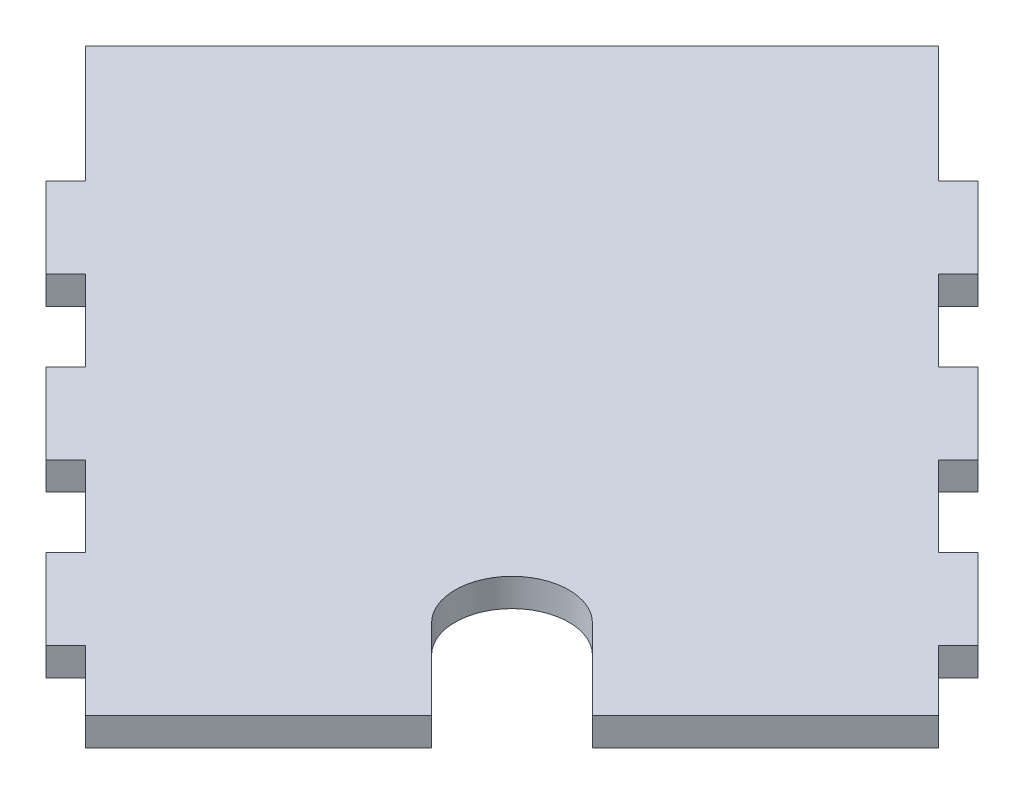
ISO-10303-21;
HEADER;
FILE_DESCRIPTION(('STEP AP214'),'2;1');
FILE_NAME('part.step','',(''),(''),'','','');
FILE_SCHEMA(('AUTOMOTIVE_DESIGN { 1 0 10303 214 1 1 1 1 }'));
ENDSEC;
DATA;
#1=APPLICATION_CONTEXT('core data for automotive mechanical design processes');
#2=APPLICATION_PROTOCOL_DEFINITION('international standard','automotive_design',2000,#1);
#3=PRODUCT_CONTEXT('',#1,'mechanical');
#4=PRODUCT('Part','Part','',(#3));
#5=PRODUCT_RELATED_PRODUCT_CATEGORY('part','',(#4));
#6=PRODUCT_DEFINITION_FORMATION('','',#4);
#7=PRODUCT_DEFINITION_CONTEXT('part definition',#1,'design');
#8=PRODUCT_DEFINITION('design','',#6,#7);
#9=PRODUCT_DEFINITION_SHAPE('','',#8);
#10=(LENGTH_UNIT() NAMED_UNIT(*) SI_UNIT(.MILLI.,.METRE.));
#11=(NAMED_UNIT(*) PLANE_ANGLE_UNIT() SI_UNIT($,.RADIAN.));
#12=(NAMED_UNIT(*) SI_UNIT($,.STERADIAN.) SOLID_ANGLE_UNIT());
#13=UNCERTAINTY_MEASURE_WITH_UNIT(LENGTH_MEASURE(1.E-05),#10,'distance_accuracy_value','');
#14=(GEOMETRIC_REPRESENTATION_CONTEXT(3) GLOBAL_UNCERTAINTY_ASSIGNED_CONTEXT((#13)) GLOBAL_UNIT_ASSIGNED_CONTEXT((#10,
#11,#12)) REPRESENTATION_CONTEXT('',''));
#15=CARTESIAN_POINT('',(0.,0.,0.));
#16=DIRECTION('',(0.,0.,1.));
#17=DIRECTION('',(1.,0.,0.));
#18=AXIS2_PLACEMENT_3D('',#15,#16,#17);
#19=CARTESIAN_POINT('',(123.911019042198,3.1242,-83.2043485428546));
#20=DIRECTION('',(-0.707106781186547,0.,0.707106781186547));
#21=DIRECTION('',(0.707106781186548,0.,0.707106781186548));
#22=AXIS2_PLACEMENT_3D('',#19,#20,#21);
#23=PLANE('',#22);
#24=DIRECTION('',(-0.707106781186548,0.,-0.707106781186548));
#25=VECTOR('',#24,1.);
#26=CARTESIAN_POINT('',(123.911019042198,0.,-83.2043485428546));
#27=LINE('',#26,#25);
#28=CARTESIAN_POINT('',(123.911019042198,0.,-83.2043485428546));
#29=VERTEX_POINT('',#28);
#30=CARTESIAN_POINT('',(114.930762921129,0.,-92.1846046639238));
#31=VERTEX_POINT('',#30);
#32=EDGE_CURVE('E273',#29,#31,#27,.T.);
#33=ORIENTED_EDGE('',*,*,#32,.T.);
#34=DIRECTION('',(0.,-1.,0.));
#35=VECTOR('',#34,1.);
#36=CARTESIAN_POINT('',(114.930762921129,3.1242,-92.1846046639238));
#37=LINE('',#36,#35);
#38=CARTESIAN_POINT('',(114.930762921129,3.1242,-92.1846046639238));
#39=VERTEX_POINT('',#38);
#40=EDGE_CURVE('E11',#39,#31,#37,.T.);
#41=ORIENTED_EDGE('',*,*,#40,.F.);
#42=DIRECTION('',(-0.707106781186548,0.,-0.707106781186548));
#43=VECTOR('',#42,1.);
#44=CARTESIAN_POINT('',(123.911019042198,3.1242,-83.2043485428546));
#45=LINE('',#44,#43);
#46=CARTESIAN_POINT('',(123.911019042198,3.1242,-83.2043485428546));
#47=VERTEX_POINT('',#46);
#48=EDGE_CURVE('E335',#47,#39,#45,.T.);
#49=ORIENTED_EDGE('',*,*,#48,.F.);
#50=DIRECTION('',(0.,-1.,0.));
#51=VECTOR('',#50,1.);
#52=CARTESIAN_POINT('',(123.911019042198,3.1242,-83.2043485428546));
#53=LINE('',#52,#51);
#54=EDGE_CURVE('E269',#47,#29,#53,.T.);
#55=ORIENTED_EDGE('',*,*,#54,.T.);
#56=EDGE_LOOP('',(#33,#41,#49,#55));
#57=FACE_BOUND('',#56,.T.);
#58=ADVANCED_FACE('F33',(#57),#23,.F.);
#59=CARTESIAN_POINT('',(114.930762921129,3.1242,-92.1846046639238));
#60=DIRECTION('',(0.707106781186548,0.,0.707106781186548));
#61=DIRECTION('',(0.707106781186548,0.,-0.707106781186548));
#62=AXIS2_PLACEMENT_3D('',#59,#60,#61);
#63=PLANE('',#62);
#64=DIRECTION('',(-0.707106781186547,0.,0.707106781186547));
#65=VECTOR('',#64,1.);
#66=CARTESIAN_POINT('',(114.930762921129,0.,-92.1846046639238));
#67=LINE('',#66,#65);
#68=CARTESIAN_POINT('',(112.721619915346,0.,-89.9754616581409));
#69=VERTEX_POINT('',#68);
#70=EDGE_CURVE('E276',#31,#69,#67,.T.);
#71=ORIENTED_EDGE('',*,*,#70,.T.);
#72=DIRECTION('',(0.,-1.,0.));
#73=VECTOR('',#72,1.);
#74=CARTESIAN_POINT('',(112.721619915346,3.1242,-89.9754616581409));
#75=LINE('',#74,#73);
#76=CARTESIAN_POINT('',(112.721619915346,3.1242,-89.9754616581409));
#77=VERTEX_POINT('',#76);
#78=EDGE_CURVE('E41',#77,#69,#75,.T.);
#79=ORIENTED_EDGE('',*,*,#78,.F.);
#80=DIRECTION('',(-0.707106781186547,0.,0.707106781186547));
#81=VECTOR('',#80,1.);
#82=CARTESIAN_POINT('',(114.930762921129,3.1242,-92.1846046639238));
#83=LINE('',#82,#81);
#84=EDGE_CURVE('E164',#39,#77,#83,.T.);
#85=ORIENTED_EDGE('',*,*,#84,.F.);
#86=ORIENTED_EDGE('',*,*,#40,.T.);
#87=EDGE_LOOP('',(#71,#79,#85,#86));
#88=FACE_BOUND('',#87,.T.);
#89=ADVANCED_FACE('F513',(#88),#63,.F.);
#90=CARTESIAN_POINT('',(112.721619915346,3.1242,-89.9754616581409));
#91=DIRECTION('',(-0.707106781186548,0.,0.707106781186548));
#92=DIRECTION('',(0.707106781186548,0.,0.707106781186548));
#93=AXIS2_PLACEMENT_3D('',#90,#91,#92);
#94=PLANE('',#93);
#95=DIRECTION('',(-0.707106781186547,0.,-0.707106781186547));
#96=VECTOR('',#95,1.);
#97=CARTESIAN_POINT('',(112.721619915346,0.,-89.9754616581409));
#98=LINE('',#97,#96);
#99=CARTESIAN_POINT('',(103.741363794277,0.,-98.9557177792099));
#100=VERTEX_POINT('',#99);
#101=EDGE_CURVE('E278',#69,#100,#98,.T.);
#102=ORIENTED_EDGE('',*,*,#101,.T.);
#103=DIRECTION('',(0.,-1.,0.));
#104=VECTOR('',#103,1.);
#105=CARTESIAN_POINT('',(103.741363794277,3.1242,-98.9557177792099));
#106=LINE('',#105,#104);
#107=CARTESIAN_POINT('',(103.741363794277,3.1242,-98.9557177792099));
#108=VERTEX_POINT('',#107);
#109=EDGE_CURVE('E414',#108,#100,#106,.T.);
#110=ORIENTED_EDGE('',*,*,#109,.F.);
#111=DIRECTION('',(-0.707106781186547,0.,-0.707106781186547));
#112=VECTOR('',#111,1.);
#113=CARTESIAN_POINT('',(112.721619915346,3.1242,-89.9754616581409));
#114=LINE('',#113,#112);
#115=EDGE_CURVE('E422',#77,#108,#114,.T.);
#116=ORIENTED_EDGE('',*,*,#115,.F.);
#117=ORIENTED_EDGE('',*,*,#78,.T.);
#118=EDGE_LOOP('',(#102,#110,#116,#117));
#119=FACE_BOUND('',#118,.T.);
#120=ADVANCED_FACE('F420',(#119),#94,.F.);
#121=CARTESIAN_POINT('',(103.741363794277,3.1242,-98.9557177792099));
#122=DIRECTION('',(-0.707106781186552,0.,-0.707106781186543));
#123=DIRECTION('',(-0.707106781186543,0.,0.707106781186552));
#124=AXIS2_PLACEMENT_3D('',#121,#122,#123);
#125=PLANE('',#124);
#126=DIRECTION('',(0.707106781186543,0.,-0.707106781186552));
#127=VECTOR('',#126,1.);
#128=CARTESIAN_POINT('',(103.741363794277,0.,-98.9557177792099));
#129=LINE('',#128,#127);
#130=CARTESIAN_POINT('',(105.95050680006,0.,-101.164860784993));
#131=VERTEX_POINT('',#130);
#132=EDGE_CURVE('E280',#100,#131,#129,.T.);
#133=ORIENTED_EDGE('',*,*,#132,.T.);
#134=DIRECTION('',(0.,-1.,0.));
#135=VECTOR('',#134,1.);
#136=CARTESIAN_POINT('',(105.95050680006,3.1242,-101.164860784993));
#137=LINE('',#136,#135);
#138=CARTESIAN_POINT('',(105.95050680006,3.1242,-101.164860784993));
#139=VERTEX_POINT('',#138);
#140=EDGE_CURVE('E411',#139,#131,#137,.T.);
#141=ORIENTED_EDGE('',*,*,#140,.F.);
#142=DIRECTION('',(0.707106781186543,0.,-0.707106781186552));
#143=VECTOR('',#142,1.);
#144=CARTESIAN_POINT('',(103.741363794277,3.1242,-98.9557177792099));
#145=LINE('',#144,#143);
#146=EDGE_CURVE('E440',#108,#139,#145,.T.);
#147=ORIENTED_EDGE('',*,*,#146,.F.);
#148=ORIENTED_EDGE('',*,*,#109,.T.);
#149=EDGE_LOOP('',(#133,#141,#147,#148));
#150=FACE_BOUND('',#149,.T.);
#151=ADVANCED_FACE('F431',(#150),#125,.F.);
#152=CARTESIAN_POINT('',(105.95050680006,3.1242,-101.164860784993));
#153=DIRECTION('',(-0.707106781186565,0.,0.70710678118653));
#154=DIRECTION('',(0.70710678118653,0.,0.707106781186565));
#155=AXIS2_PLACEMENT_3D('',#152,#153,#154);
#156=PLANE('',#155);
#157=DIRECTION('',(-0.70710678118653,0.,-0.707106781186565));
#158=VECTOR('',#157,1.);
#159=CARTESIAN_POINT('',(105.95050680006,0.,-101.164860784993));
#160=LINE('',#159,#158);
#161=CARTESIAN_POINT('',(96.9702506789912,0.,-110.145116906062));
#162=VERTEX_POINT('',#161);
#163=EDGE_CURVE('E282',#131,#162,#160,.T.);
#164=ORIENTED_EDGE('',*,*,#163,.T.);
#165=DIRECTION('',(0.,-1.,0.));
#166=VECTOR('',#165,1.);
#167=CARTESIAN_POINT('',(96.9702506789912,3.1242,-110.145116906062));
#168=LINE('',#167,#166);
#169=CARTESIAN_POINT('',(96.9702506789912,3.1242,-110.145116906062));
#170=VERTEX_POINT('',#169);
#171=EDGE_CURVE('E408',#170,#162,#168,.T.);
#172=ORIENTED_EDGE('',*,*,#171,.F.);
#173=DIRECTION('',(-0.70710678118653,0.,-0.707106781186565));
#174=VECTOR('',#173,1.);
#175=CARTESIAN_POINT('',(105.95050680006,3.1242,-101.164860784993));
#176=LINE('',#175,#174);
#177=EDGE_CURVE('E437',#139,#170,#176,.T.);
#178=ORIENTED_EDGE('',*,*,#177,.F.);
#179=ORIENTED_EDGE('',*,*,#140,.T.);
#180=EDGE_LOOP('',(#164,#172,#178,#179));
#181=FACE_BOUND('',#180,.T.);
#182=ADVANCED_FACE('F435',(#181),#156,.F.);
#183=CARTESIAN_POINT('',(96.9702506789912,3.1242,-110.145116906062));
#184=DIRECTION('',(0.707106781186512,0.,0.707106781186583));
#185=DIRECTION('',(0.707106781186583,0.,-0.707106781186512));
#186=AXIS2_PLACEMENT_3D('',#183,#184,#185);
#187=PLANE('',#186);
#188=DIRECTION('',(-0.707106781186583,0.,0.707106781186512));
#189=VECTOR('',#188,1.);
#190=CARTESIAN_POINT('',(96.9702506789912,0.,-110.145116906062));
#191=LINE('',#190,#189);
#192=CARTESIAN_POINT('',(94.761107673208,0.,-107.935973900279));
#193=VERTEX_POINT('',#192);
#194=EDGE_CURVE('E284',#162,#193,#191,.T.);
#195=ORIENTED_EDGE('',*,*,#194,.T.);
#196=DIRECTION('',(0.,-1.,0.));
#197=VECTOR('',#196,1.);
#198=CARTESIAN_POINT('',(94.761107673208,3.1242,-107.935973900279));
#199=LINE('',#198,#197);
#200=CARTESIAN_POINT('',(94.761107673208,3.1242,-107.935973900279));
#201=VERTEX_POINT('',#200);
#202=EDGE_CURVE('E405',#201,#193,#199,.T.);
#203=ORIENTED_EDGE('',*,*,#202,.F.);
#204=DIRECTION('',(-0.707106781186583,0.,0.707106781186512));
#205=VECTOR('',#204,1.);
#206=CARTESIAN_POINT('',(96.9702506789912,3.1242,-110.145116906062));
#207=LINE('',#206,#205);
#208=EDGE_CURVE('E439',#170,#201,#207,.T.);
#209=ORIENTED_EDGE('',*,*,#208,.F.);
#210=ORIENTED_EDGE('',*,*,#171,.T.);
#211=EDGE_LOOP('',(#195,#203,#209,#210));
#212=FACE_BOUND('',#211,.T.);
#213=ADVANCED_FACE('F526',(#212),#187,.F.);
#214=CARTESIAN_POINT('',(94.761107673208,3.1242,-107.935973900279));
#215=DIRECTION('',(-0.707106781186548,0.,0.707106781186547));
#216=DIRECTION('',(0.707106781186547,0.,0.707106781186548));
#217=AXIS2_PLACEMENT_3D('',#214,#215,#216);
#218=PLANE('',#217);
#219=DIRECTION('',(-0.707106781186547,0.,-0.707106781186548));
#220=VECTOR('',#219,1.);
#221=CARTESIAN_POINT('',(94.761107673208,0.,-107.935973900279));
#222=LINE('',#221,#220);
#223=CARTESIAN_POINT('',(81.7076326651241,0.,-120.989448908363));
#224=VERTEX_POINT('',#223);
#225=EDGE_CURVE('E286',#193,#224,#222,.T.);
#226=ORIENTED_EDGE('',*,*,#225,.T.);
#227=DIRECTION('',(0.,-1.,0.));
#228=VECTOR('',#227,1.);
#229=CARTESIAN_POINT('',(81.7076326651241,3.1242,-120.989448908363));
#230=LINE('',#229,#228);
#231=CARTESIAN_POINT('',(81.7076326651241,3.1242,-120.989448908363));
#232=VERTEX_POINT('',#231);
#233=EDGE_CURVE('E402',#232,#224,#230,.T.);
#234=ORIENTED_EDGE('',*,*,#233,.F.);
#235=DIRECTION('',(-0.707106781186547,0.,-0.707106781186548));
#236=VECTOR('',#235,1.);
#237=CARTESIAN_POINT('',(94.761107673208,3.1242,-107.935973900279));
#238=LINE('',#237,#236);
#239=EDGE_CURVE('E442',#201,#232,#238,.T.);
#240=ORIENTED_EDGE('',*,*,#239,.F.);
#241=ORIENTED_EDGE('',*,*,#202,.T.);
#242=EDGE_LOOP('',(#226,#234,#240,#241));
#243=FACE_BOUND('',#242,.T.);
#244=ADVANCED_FACE('F529',(#243),#218,.F.);
#245=CARTESIAN_POINT('',(81.7076326651241,3.1242,-120.989448908363));
#246=DIRECTION('',(0.707106781186544,0.,0.707106781186551));
#247=DIRECTION('',(0.707106781186551,0.,-0.707106781186544));
#248=AXIS2_PLACEMENT_3D('',#245,#246,#247);
#249=PLANE('',#248);
#250=DIRECTION('',(-0.707106781186551,0.,0.707106781186544));
#251=VECTOR('',#250,1.);
#252=CARTESIAN_POINT('',(81.7076326651241,0.,-120.989448908363));
#253=LINE('',#252,#251);
#254=CARTESIAN_POINT('',(34.1122752234575,0.,-73.394091466697));
#255=VERTEX_POINT('',#254);
#256=EDGE_CURVE('E288',#224,#255,#253,.T.);
#257=ORIENTED_EDGE('',*,*,#256,.T.);
#258=DIRECTION('',(0.,-1.,0.));
#259=VECTOR('',#258,1.);
#260=CARTESIAN_POINT('',(34.1122752234575,3.1242,-73.394091466697));
#261=LINE('',#260,#259);
#262=CARTESIAN_POINT('',(34.1122752234575,3.1242,-73.394091466697));
#263=VERTEX_POINT('',#262);
#264=EDGE_CURVE('E399',#263,#255,#261,.T.);
#265=ORIENTED_EDGE('',*,*,#264,.F.);
#266=DIRECTION('',(-0.707106781186551,0.,0.707106781186544));
#267=VECTOR('',#266,1.);
#268=CARTESIAN_POINT('',(81.7076326651241,3.1242,-120.989448908363));
#269=LINE('',#268,#267);
#270=EDGE_CURVE('E448',#232,#263,#269,.T.);
#271=ORIENTED_EDGE('',*,*,#270,.F.);
#272=ORIENTED_EDGE('',*,*,#233,.T.);
#273=EDGE_LOOP('',(#257,#265,#271,#272));
#274=FACE_BOUND('',#273,.T.);
#275=ADVANCED_FACE('F533',(#274),#249,.F.);
#276=CARTESIAN_POINT('',(34.1122752234575,3.1242,-73.394091466697));
#277=DIRECTION('',(0.707106781186545,0.,-0.70710678118655));
#278=DIRECTION('',(-0.70710678118655,0.,-0.707106781186545));
#279=AXIS2_PLACEMENT_3D('',#276,#277,#278);
#280=PLANE('',#279);
#281=DIRECTION('',(0.70710678118655,0.,0.707106781186545));
#282=VECTOR('',#281,1.);
#283=CARTESIAN_POINT('',(34.1122752234575,0.,-73.394091466697));
#284=LINE('',#283,#282);
#285=CARTESIAN_POINT('',(47.1657502315415,0.,-60.3406164586132));
#286=VERTEX_POINT('',#285);
#287=EDGE_CURVE('E290',#255,#286,#284,.T.);
#288=ORIENTED_EDGE('',*,*,#287,.T.);
#289=DIRECTION('',(0.,-1.,0.));
#290=VECTOR('',#289,1.);
#291=CARTESIAN_POINT('',(47.1657502315415,3.1242,-60.3406164586132));
#292=LINE('',#291,#290);
#293=CARTESIAN_POINT('',(47.1657502315415,3.1242,-60.3406164586132));
#294=VERTEX_POINT('',#293);
#295=EDGE_CURVE('E396',#294,#286,#292,.T.);
#296=ORIENTED_EDGE('',*,*,#295,.F.);
#297=DIRECTION('',(0.70710678118655,0.,0.707106781186545));
#298=VECTOR('',#297,1.);
#299=CARTESIAN_POINT('',(34.1122752234575,3.1242,-73.394091466697));
#300=LINE('',#299,#298);
#301=EDGE_CURVE('E450',#263,#294,#300,.T.);
#302=ORIENTED_EDGE('',*,*,#301,.F.);
#303=ORIENTED_EDGE('',*,*,#264,.T.);
#304=EDGE_LOOP('',(#288,#296,#302,#303));
#305=FACE_BOUND('',#304,.T.);
#306=ADVANCED_FACE('F537',(#305),#280,.F.);
#307=CARTESIAN_POINT('',(47.1657502315415,3.1242,-60.3406164586132));
#308=DIRECTION('',(0.70710678118666,0.,0.707106781186435));
#309=DIRECTION('',(0.707106781186435,0.,-0.70710678118666));
#310=AXIS2_PLACEMENT_3D('',#307,#308,#309);
#311=PLANE('',#310);
#312=DIRECTION('',(-0.707106781186435,0.,0.70710678118666));
#313=VECTOR('',#312,1.);
#314=CARTESIAN_POINT('',(47.1657502315415,0.,-60.3406164586132));
#315=LINE('',#314,#313);
#316=CARTESIAN_POINT('',(44.9566072257586,0.,-58.1314734528295));
#317=VERTEX_POINT('',#316);
#318=EDGE_CURVE('E292',#286,#317,#315,.T.);
#319=ORIENTED_EDGE('',*,*,#318,.T.);
#320=DIRECTION('',(0.,-1.,0.));
#321=VECTOR('',#320,1.);
#322=CARTESIAN_POINT('',(44.9566072257586,3.1242,-58.1314734528295));
#323=LINE('',#322,#321);
#324=CARTESIAN_POINT('',(44.9566072257586,3.1242,-58.1314734528295));
#325=VERTEX_POINT('',#324);
#326=EDGE_CURVE('E393',#325,#317,#323,.T.);
#327=ORIENTED_EDGE('',*,*,#326,.F.);
#328=DIRECTION('',(-0.707106781186435,0.,0.70710678118666));
#329=VECTOR('',#328,1.);
#330=CARTESIAN_POINT('',(47.1657502315415,3.1242,-60.3406164586132));
#331=LINE('',#330,#329);
#332=EDGE_CURVE('E452',#294,#325,#331,.T.);
#333=ORIENTED_EDGE('',*,*,#332,.F.);
#334=ORIENTED_EDGE('',*,*,#295,.T.);
#335=EDGE_LOOP('',(#319,#327,#333,#334));
#336=FACE_BOUND('',#335,.T.);
#337=ADVANCED_FACE('F541',(#336),#311,.F.);
#338=CARTESIAN_POINT('',(44.9566072257586,3.1242,-58.1314734528295));
#339=DIRECTION('',(0.707106781186527,0.,-0.707106781186568));
#340=DIRECTION('',(-0.707106781186568,0.,-0.707106781186527));
#341=AXIS2_PLACEMENT_3D('',#338,#339,#340);
#342=PLANE('',#341);
#343=DIRECTION('',(0.707106781186568,0.,0.707106781186527));
#344=VECTOR('',#343,1.);
#345=CARTESIAN_POINT('',(44.9566072257586,0.,-58.1314734528295));
#346=LINE('',#345,#344);
#347=CARTESIAN_POINT('',(53.936863346828,0.,-49.1512173317606));
#348=VERTEX_POINT('',#347);
#349=EDGE_CURVE('E294',#317,#348,#346,.T.);
#350=ORIENTED_EDGE('',*,*,#349,.T.);
#351=DIRECTION('',(0.,-1.,0.));
#352=VECTOR('',#351,1.);
#353=CARTESIAN_POINT('',(53.936863346828,3.1242,-49.1512173317606));
#354=LINE('',#353,#352);
#355=CARTESIAN_POINT('',(53.936863346828,3.1242,-49.1512173317606));
#356=VERTEX_POINT('',#355);
#357=EDGE_CURVE('E390',#356,#348,#354,.T.);
#358=ORIENTED_EDGE('',*,*,#357,.F.);
#359=DIRECTION('',(0.707106781186568,0.,0.707106781186527));
#360=VECTOR('',#359,1.);
#361=CARTESIAN_POINT('',(44.9566072257586,3.1242,-58.1314734528295));
#362=LINE('',#361,#360);
#363=EDGE_CURVE('E454',#325,#356,#362,.T.);
#364=ORIENTED_EDGE('',*,*,#363,.F.);
#365=ORIENTED_EDGE('',*,*,#326,.T.);
#366=EDGE_LOOP('',(#350,#358,#364,#365));
#367=FACE_BOUND('',#366,.T.);
#368=ADVANCED_FACE('F545',(#367),#342,.F.);
#369=CARTESIAN_POINT('',(53.936863346828,3.1242,-49.1512173317606));
#370=DIRECTION('',(-0.70710678118655,0.,-0.707106781186545));
#371=DIRECTION('',(-0.707106781186545,0.,0.70710678118655));
#372=AXIS2_PLACEMENT_3D('',#369,#370,#371);
#373=PLANE('',#372);
#374=DIRECTION('',(0.707106781186545,0.,-0.70710678118655));
#375=VECTOR('',#374,1.);
#376=CARTESIAN_POINT('',(53.936863346828,0.,-49.1512173317606));
#377=LINE('',#376,#375);
#378=CARTESIAN_POINT('',(56.146006352611,0.,-51.3603603375437));
#379=VERTEX_POINT('',#378);
#380=EDGE_CURVE('E296',#348,#379,#377,.T.);
#381=ORIENTED_EDGE('',*,*,#380,.T.);
#382=DIRECTION('',(0.,-1.,0.));
#383=VECTOR('',#382,1.);
#384=CARTESIAN_POINT('',(56.146006352611,3.1242,-51.3603603375437));
#385=LINE('',#384,#383);
#386=CARTESIAN_POINT('',(56.146006352611,3.1242,-51.3603603375437));
#387=VERTEX_POINT('',#386);
#388=EDGE_CURVE('E387',#387,#379,#385,.T.);
#389=ORIENTED_EDGE('',*,*,#388,.F.);
#390=DIRECTION('',(0.707106781186545,0.,-0.70710678118655));
#391=VECTOR('',#390,1.);
#392=CARTESIAN_POINT('',(53.936863346828,3.1242,-49.1512173317606));
#393=LINE('',#392,#391);
#394=EDGE_CURVE('E456',#356,#387,#393,.T.);
#395=ORIENTED_EDGE('',*,*,#394,.F.);
#396=ORIENTED_EDGE('',*,*,#357,.T.);
#397=EDGE_LOOP('',(#381,#389,#395,#396));
#398=FACE_BOUND('',#397,.T.);
#399=ADVANCED_FACE('F549',(#398),#373,.F.);
#400=CARTESIAN_POINT('',(56.146006352611,3.1242,-51.3603603375437));
#401=DIRECTION('',(0.707106781186544,0.,-0.70710678118655));
#402=DIRECTION('',(-0.707106781186551,0.,-0.707106781186545));
#403=AXIS2_PLACEMENT_3D('',#400,#401,#402);
#404=PLANE('',#403);
#405=DIRECTION('',(0.707106781186551,0.,0.707106781186545));
#406=VECTOR('',#405,1.);
#407=CARTESIAN_POINT('',(56.146006352611,0.,-51.3603603375437));
#408=LINE('',#407,#406);
#409=CARTESIAN_POINT('',(65.1262624736799,0.,-42.3801042164749));
#410=VERTEX_POINT('',#409);
#411=EDGE_CURVE('E298',#379,#410,#408,.T.);
#412=ORIENTED_EDGE('',*,*,#411,.T.);
#413=DIRECTION('',(0.,-1.,0.));
#414=VECTOR('',#413,1.);
#415=CARTESIAN_POINT('',(65.1262624736799,3.1242,-42.3801042164749));
#416=LINE('',#415,#414);
#417=CARTESIAN_POINT('',(65.1262624736799,3.1242,-42.3801042164749));
#418=VERTEX_POINT('',#417);
#419=EDGE_CURVE('E384',#418,#410,#416,.T.);
#420=ORIENTED_EDGE('',*,*,#419,.F.);
#421=DIRECTION('',(0.707106781186551,0.,0.707106781186545));
#422=VECTOR('',#421,1.);
#423=CARTESIAN_POINT('',(56.146006352611,3.1242,-51.3603603375437));
#424=LINE('',#423,#422);
#425=EDGE_CURVE('E458',#387,#418,#424,.T.);
#426=ORIENTED_EDGE('',*,*,#425,.F.);
#427=ORIENTED_EDGE('',*,*,#388,.T.);
#428=EDGE_LOOP('',(#412,#420,#426,#427));
#429=FACE_BOUND('',#428,.T.);
#430=ADVANCED_FACE('F553',(#429),#404,.F.);
#431=CARTESIAN_POINT('',(65.1262624736799,3.1242,-42.3801042164749));
#432=DIRECTION('',(0.707106781186549,0.,0.707106781186546));
#433=DIRECTION('',(0.707106781186546,0.,-0.707106781186549));
#434=AXIS2_PLACEMENT_3D('',#431,#432,#433);
#435=PLANE('',#434);
#436=DIRECTION('',(-0.707106781186546,0.,0.707106781186549));
#437=VECTOR('',#436,1.);
#438=CARTESIAN_POINT('',(65.1262624736799,0.,-42.3801042164749));
#439=LINE('',#438,#437);
#440=CARTESIAN_POINT('',(62.9171194678968,0.,-40.1709612106919));
#441=VERTEX_POINT('',#440);
#442=EDGE_CURVE('E300',#410,#441,#439,.T.);
#443=ORIENTED_EDGE('',*,*,#442,.T.);
#444=DIRECTION('',(0.,-1.,0.));
#445=VECTOR('',#444,1.);
#446=CARTESIAN_POINT('',(62.9171194678968,3.1242,-40.1709612106919));
#447=LINE('',#446,#445);
#448=CARTESIAN_POINT('',(62.9171194678968,3.1242,-40.1709612106919));
#449=VERTEX_POINT('',#448);
#450=EDGE_CURVE('E381',#449,#441,#447,.T.);
#451=ORIENTED_EDGE('',*,*,#450,.F.);
#452=DIRECTION('',(-0.707106781186546,0.,0.707106781186549));
#453=VECTOR('',#452,1.);
#454=CARTESIAN_POINT('',(65.1262624736799,3.1242,-42.3801042164749));
#455=LINE('',#454,#453);
#456=EDGE_CURVE('E460',#418,#449,#455,.T.);
#457=ORIENTED_EDGE('',*,*,#456,.F.);
#458=ORIENTED_EDGE('',*,*,#419,.T.);
#459=EDGE_LOOP('',(#443,#451,#457,#458));
#460=FACE_BOUND('',#459,.T.);
#461=ADVANCED_FACE('F557',(#460),#435,.F.);
#462=CARTESIAN_POINT('',(62.9171194678968,3.1242,-40.1709612106919));
#463=DIRECTION('',(0.707106781186544,0.,-0.707106781186551));
#464=DIRECTION('',(-0.707106781186551,0.,-0.707106781186544));
#465=AXIS2_PLACEMENT_3D('',#462,#463,#464);
#466=PLANE('',#465);
#467=DIRECTION('',(0.707106781186551,0.,0.707106781186544));
#468=VECTOR('',#467,1.);
#469=CARTESIAN_POINT('',(62.9171194678968,0.,-40.1709612106919));
#470=LINE('',#469,#468);
#471=CARTESIAN_POINT('',(71.897375588966,0.,-31.1907050896228));
#472=VERTEX_POINT('',#471);
#473=EDGE_CURVE('E302',#441,#472,#470,.T.);
#474=ORIENTED_EDGE('',*,*,#473,.T.);
#475=DIRECTION('',(0.,-1.,0.));
#476=VECTOR('',#475,1.);
#477=CARTESIAN_POINT('',(71.897375588966,3.1242,-31.1907050896228));
#478=LINE('',#477,#476);
#479=CARTESIAN_POINT('',(71.897375588966,3.1242,-31.1907050896228));
#480=VERTEX_POINT('',#479);
#481=EDGE_CURVE('E378',#480,#472,#478,.T.);
#482=ORIENTED_EDGE('',*,*,#481,.F.);
#483=DIRECTION('',(0.707106781186551,0.,0.707106781186544));
#484=VECTOR('',#483,1.);
#485=CARTESIAN_POINT('',(62.9171194678968,3.1242,-40.1709612106919));
#486=LINE('',#485,#484);
#487=EDGE_CURVE('E462',#449,#480,#486,.T.);
#488=ORIENTED_EDGE('',*,*,#487,.F.);
#489=ORIENTED_EDGE('',*,*,#450,.T.);
#490=EDGE_LOOP('',(#474,#482,#488,#489));
#491=FACE_BOUND('',#490,.T.);
#492=ADVANCED_FACE('F561',(#491),#466,.F.);
#493=CARTESIAN_POINT('',(71.897375588966,3.1242,-31.1907050896228));
#494=DIRECTION('',(-0.70710678118655,0.,-0.707106781186545));
#495=DIRECTION('',(-0.707106781186545,0.,0.70710678118655));
#496=AXIS2_PLACEMENT_3D('',#493,#494,#495);
#497=PLANE('',#496);
#498=DIRECTION('',(0.707106781186545,0.,-0.70710678118655));
#499=VECTOR('',#498,1.);
#500=CARTESIAN_POINT('',(71.897375588966,0.,-31.1907050896228));
#501=LINE('',#500,#499);
#502=CARTESIAN_POINT('',(74.106518594749,0.,-33.3998480954058));
#503=VERTEX_POINT('',#502);
#504=EDGE_CURVE('E304',#472,#503,#501,.T.);
#505=ORIENTED_EDGE('',*,*,#504,.T.);
#506=DIRECTION('',(0.,-1.,0.));
#507=VECTOR('',#506,1.);
#508=CARTESIAN_POINT('',(74.106518594749,3.1242,-33.3998480954058));
#509=LINE('',#508,#507);
#510=CARTESIAN_POINT('',(74.106518594749,3.1242,-33.3998480954058));
#511=VERTEX_POINT('',#510);
#512=EDGE_CURVE('E375',#511,#503,#509,.T.);
#513=ORIENTED_EDGE('',*,*,#512,.F.);
#514=DIRECTION('',(0.707106781186545,0.,-0.70710678118655));
#515=VECTOR('',#514,1.);
#516=CARTESIAN_POINT('',(71.897375588966,3.1242,-31.1907050896228));
#517=LINE('',#516,#515);
#518=EDGE_CURVE('E464',#480,#511,#517,.T.);
#519=ORIENTED_EDGE('',*,*,#518,.F.);
#520=ORIENTED_EDGE('',*,*,#481,.T.);
#521=EDGE_LOOP('',(#505,#513,#519,#520));
#522=FACE_BOUND('',#521,.T.);
#523=ADVANCED_FACE('F565',(#522),#497,.F.);
#524=CARTESIAN_POINT('',(74.106518594749,3.1242,-33.3998480954058));
#525=DIRECTION('',(0.707106781186544,0.,-0.70710678118655));
#526=DIRECTION('',(-0.70710678118655,0.,-0.707106781186545));
#527=AXIS2_PLACEMENT_3D('',#524,#525,#526);
#528=PLANE('',#527);
#529=DIRECTION('',(0.707106781186551,0.,0.707106781186545));
#530=VECTOR('',#529,1.);
#531=CARTESIAN_POINT('',(74.106518594749,0.,-33.3998480954058));
#532=LINE('',#531,#530);
#533=CARTESIAN_POINT('',(83.0867747158182,0.,-24.4195919743367));
#534=VERTEX_POINT('',#533);
#535=EDGE_CURVE('E306',#503,#534,#532,.T.);
#536=ORIENTED_EDGE('',*,*,#535,.T.);
#537=DIRECTION('',(0.,-1.,0.));
#538=VECTOR('',#537,1.);
#539=CARTESIAN_POINT('',(83.0867747158182,3.1242,-24.4195919743367));
#540=LINE('',#539,#538);
#541=CARTESIAN_POINT('',(83.0867747158182,3.1242,-24.4195919743367));
#542=VERTEX_POINT('',#541);
#543=EDGE_CURVE('E372',#542,#534,#540,.T.);
#544=ORIENTED_EDGE('',*,*,#543,.F.);
#545=DIRECTION('',(0.707106781186551,0.,0.707106781186545));
#546=VECTOR('',#545,1.);
#547=CARTESIAN_POINT('',(74.106518594749,3.1242,-33.3998480954058));
#548=LINE('',#547,#546);
#549=EDGE_CURVE('E466',#511,#542,#548,.T.);
#550=ORIENTED_EDGE('',*,*,#549,.F.);
#551=ORIENTED_EDGE('',*,*,#512,.T.);
#552=EDGE_LOOP('',(#536,#544,#550,#551));
#553=FACE_BOUND('',#552,.T.);
#554=ADVANCED_FACE('F569',(#553),#528,.F.);
#555=CARTESIAN_POINT('',(83.0867747158182,3.1242,-24.4195919743367));
#556=DIRECTION('',(0.707106781186545,0.,0.70710678118655));
#557=DIRECTION('',(0.70710678118655,0.,-0.707106781186545));
#558=AXIS2_PLACEMENT_3D('',#555,#556,#557);
#559=PLANE('',#558);
#560=DIRECTION('',(-0.70710678118655,0.,0.707106781186545));
#561=VECTOR('',#560,1.);
#562=CARTESIAN_POINT('',(83.0867747158182,0.,-24.4195919743367));
#563=LINE('',#562,#561);
#564=CARTESIAN_POINT('',(80.8776317100352,0.,-22.2104489685537));
#565=VERTEX_POINT('',#564);
#566=EDGE_CURVE('E308',#534,#565,#563,.T.);
#567=ORIENTED_EDGE('',*,*,#566,.T.);
#568=DIRECTION('',(0.,-1.,0.));
#569=VECTOR('',#568,1.);
#570=CARTESIAN_POINT('',(80.8776317100352,3.1242,-22.2104489685537));
#571=LINE('',#570,#569);
#572=CARTESIAN_POINT('',(80.8776317100352,3.1242,-22.2104489685537));
#573=VERTEX_POINT('',#572);
#574=EDGE_CURVE('E369',#573,#565,#571,.T.);
#575=ORIENTED_EDGE('',*,*,#574,.F.);
#576=DIRECTION('',(-0.70710678118655,0.,0.707106781186545));
#577=VECTOR('',#576,1.);
#578=CARTESIAN_POINT('',(83.0867747158182,3.1242,-24.4195919743367));
#579=LINE('',#578,#577);
#580=EDGE_CURVE('E468',#542,#573,#579,.T.);
#581=ORIENTED_EDGE('',*,*,#580,.F.);
#582=ORIENTED_EDGE('',*,*,#543,.T.);
#583=EDGE_LOOP('',(#567,#575,#581,#582));
#584=FACE_BOUND('',#583,.T.);
#585=ADVANCED_FACE('F573',(#584),#559,.F.);
#586=CARTESIAN_POINT('',(80.8776317100352,3.1242,-22.2104489685537));
#587=DIRECTION('',(0.707106781186545,0.,-0.70710678118655));
#588=DIRECTION('',(-0.70710678118655,0.,-0.707106781186545));
#589=AXIS2_PLACEMENT_3D('',#586,#587,#588);
#590=PLANE('',#589);
#591=DIRECTION('',(0.70710678118655,0.,0.707106781186545));
#592=VECTOR('',#591,1.);
#593=CARTESIAN_POINT('',(80.8776317100352,0.,-22.2104489685537));
#594=LINE('',#593,#592);
#595=CARTESIAN_POINT('',(89.8578878311044,0.,-13.2301928474846));
#596=VERTEX_POINT('',#595);
#597=EDGE_CURVE('E310',#565,#596,#594,.T.);
#598=ORIENTED_EDGE('',*,*,#597,.T.);
#599=DIRECTION('',(0.,-1.,0.));
#600=VECTOR('',#599,1.);
#601=CARTESIAN_POINT('',(89.8578878311044,3.1242,-13.2301928474846));
#602=LINE('',#601,#600);
#603=CARTESIAN_POINT('',(89.8578878311044,3.1242,-13.2301928474846));
#604=VERTEX_POINT('',#603);
#605=EDGE_CURVE('E366',#604,#596,#602,.T.);
#606=ORIENTED_EDGE('',*,*,#605,.F.);
#607=DIRECTION('',(0.70710678118655,0.,0.707106781186545));
#608=VECTOR('',#607,1.);
#609=CARTESIAN_POINT('',(80.8776317100352,3.1242,-22.2104489685537));
#610=LINE('',#609,#608);
#611=EDGE_CURVE('E470',#573,#604,#610,.T.);
#612=ORIENTED_EDGE('',*,*,#611,.F.);
#613=ORIENTED_EDGE('',*,*,#574,.T.);
#614=EDGE_LOOP('',(#598,#606,#612,#613));
#615=FACE_BOUND('',#614,.T.);
#616=ADVANCED_FACE('F577',(#615),#590,.F.);
#617=CARTESIAN_POINT('',(89.8578878311044,3.1242,-13.2301928474846));
#618=DIRECTION('',(-0.70710678118655,0.,-0.707106781186545));
#619=DIRECTION('',(-0.707106781186545,0.,0.70710678118655));
#620=AXIS2_PLACEMENT_3D('',#617,#618,#619);
#621=PLANE('',#620);
#622=DIRECTION('',(0.707106781186545,0.,-0.70710678118655));
#623=VECTOR('',#622,1.);
#624=CARTESIAN_POINT('',(89.8578878311044,0.,-13.2301928474846));
#625=LINE('',#624,#623);
#626=CARTESIAN_POINT('',(92.0670308368874,0.,-15.4393358532676));
#627=VERTEX_POINT('',#626);
#628=EDGE_CURVE('E312',#596,#627,#625,.T.);
#629=ORIENTED_EDGE('',*,*,#628,.T.);
#630=DIRECTION('',(0.,-1.,0.));
#631=VECTOR('',#630,1.);
#632=CARTESIAN_POINT('',(92.0670308368874,3.1242,-15.4393358532676));
#633=LINE('',#632,#631);
#634=CARTESIAN_POINT('',(92.0670308368874,3.1242,-15.4393358532676));
#635=VERTEX_POINT('',#634);
#636=EDGE_CURVE('E363',#635,#627,#633,.T.);
#637=ORIENTED_EDGE('',*,*,#636,.F.);
#638=DIRECTION('',(0.707106781186545,0.,-0.70710678118655));
#639=VECTOR('',#638,1.);
#640=CARTESIAN_POINT('',(89.8578878311044,3.1242,-13.2301928474846));
#641=LINE('',#640,#639);
#642=EDGE_CURVE('E472',#604,#635,#641,.T.);
#643=ORIENTED_EDGE('',*,*,#642,.F.);
#644=ORIENTED_EDGE('',*,*,#605,.T.);
#645=EDGE_LOOP('',(#629,#637,#643,#644));
#646=FACE_BOUND('',#645,.T.);
#647=ADVANCED_FACE('F581',(#646),#621,.F.);
#648=CARTESIAN_POINT('',(92.0670308368874,3.1242,-15.4393358532676));
#649=DIRECTION('',(0.707106781186544,0.,-0.707106781186551));
#650=DIRECTION('',(-0.707106781186551,0.,-0.707106781186544));
#651=AXIS2_PLACEMENT_3D('',#648,#649,#650);
#652=PLANE('',#651);
#653=DIRECTION('',(0.707106781186551,0.,0.707106781186544));
#654=VECTOR('',#653,1.);
#655=CARTESIAN_POINT('',(92.0670308368874,0.,-15.4393358532676));
#656=LINE('',#655,#654);
#657=CARTESIAN_POINT('',(98.8381439521737,0.,-8.66822273798138));
#658=VERTEX_POINT('',#657);
#659=EDGE_CURVE('E314',#627,#658,#656,.T.);
#660=ORIENTED_EDGE('',*,*,#659,.T.);
#661=DIRECTION('',(0.,-1.,0.));
#662=VECTOR('',#661,1.);
#663=CARTESIAN_POINT('',(98.8381439521737,3.1242,-8.66822273798138));
#664=LINE('',#663,#662);
#665=CARTESIAN_POINT('',(98.8381439521737,3.1242,-8.66822273798138));
#666=VERTEX_POINT('',#665);
#667=EDGE_CURVE('E360',#666,#658,#664,.T.);
#668=ORIENTED_EDGE('',*,*,#667,.F.);
#669=DIRECTION('',(0.707106781186551,0.,0.707106781186544));
#670=VECTOR('',#669,1.);
#671=CARTESIAN_POINT('',(92.0670308368874,3.1242,-15.4393358532676));
#672=LINE('',#671,#670);
#673=EDGE_CURVE('E474',#635,#666,#672,.T.);
#674=ORIENTED_EDGE('',*,*,#673,.F.);
#675=ORIENTED_EDGE('',*,*,#636,.T.);
#676=EDGE_LOOP('',(#660,#668,#674,#675));
#677=FACE_BOUND('',#676,.T.);
#678=ADVANCED_FACE('F585',(#677),#652,.F.);
#679=CARTESIAN_POINT('',(98.8381439521737,3.1242,-8.66822273798138));
#680=DIRECTION('',(-0.70710678118655,0.,-0.707106781186545));
#681=DIRECTION('',(-0.707106781186545,0.,0.70710678118655));
#682=AXIS2_PLACEMENT_3D('',#679,#680,#681);
#683=PLANE('',#682);
#684=DIRECTION('',(0.707106781186545,0.,-0.70710678118655));
#685=VECTOR('',#684,1.);
#686=CARTESIAN_POINT('',(98.8381439521737,0.,-8.66822273798138));
#687=LINE('',#686,#685);
#688=CARTESIAN_POINT('',(118.145694612472,0.,-27.9757733982801));
#689=VERTEX_POINT('',#688);
#690=EDGE_CURVE('E316',#658,#689,#687,.T.);
#691=ORIENTED_EDGE('',*,*,#690,.T.);
#692=DIRECTION('',(0.,-1.,0.));
#693=VECTOR('',#692,1.);
#694=CARTESIAN_POINT('',(118.145694612472,3.1242,-27.9757733982801));
#695=LINE('',#694,#693);
#696=CARTESIAN_POINT('',(118.145694612472,3.1242,-27.9757733982801));
#697=VERTEX_POINT('',#696);
#698=EDGE_CURVE('E357',#697,#689,#695,.T.);
#699=ORIENTED_EDGE('',*,*,#698,.F.);
#700=DIRECTION('',(0.707106781186545,0.,-0.70710678118655));
#701=VECTOR('',#700,1.);
#702=CARTESIAN_POINT('',(98.8381439521737,3.1242,-8.66822273798138));
#703=LINE('',#702,#701);
#704=EDGE_CURVE('E476',#666,#697,#703,.T.);
#705=ORIENTED_EDGE('',*,*,#704,.F.);
#706=ORIENTED_EDGE('',*,*,#667,.T.);
#707=EDGE_LOOP('',(#691,#699,#705,#706));
#708=FACE_BOUND('',#707,.T.);
#709=ADVANCED_FACE('F589',(#708),#683,.F.);
#710=CARTESIAN_POINT('',(118.145694612472,3.1242,-27.9757733982801));
#711=DIRECTION('',(-0.707106781186531,0.,0.707106781186564));
#712=DIRECTION('',(0.707106781186564,0.,0.707106781186531));
#713=AXIS2_PLACEMENT_3D('',#710,#711,#712);
#714=PLANE('',#713);
#715=DIRECTION('',(-0.707106781186564,0.,-0.707106781186531));
#716=VECTOR('',#715,1.);
#717=CARTESIAN_POINT('',(118.145694612472,0.,-27.9757733982801));
#718=LINE('',#717,#716);
#719=CARTESIAN_POINT('',(109.165438491403,0.,-36.956029519349));
#720=VERTEX_POINT('',#719);
#721=EDGE_CURVE('E318',#689,#720,#718,.T.);
#722=ORIENTED_EDGE('',*,*,#721,.T.);
#723=DIRECTION('',(0.,-1.,0.));
#724=VECTOR('',#723,1.);
#725=CARTESIAN_POINT('',(109.165438491403,3.1242,-36.956029519349));
#726=LINE('',#725,#724);
#727=CARTESIAN_POINT('',(109.165438491403,3.1242,-36.956029519349));
#728=VERTEX_POINT('',#727);
#729=EDGE_CURVE('E354',#728,#720,#726,.T.);
#730=ORIENTED_EDGE('',*,*,#729,.F.);
#731=DIRECTION('',(-0.707106781186564,0.,-0.707106781186531));
#732=VECTOR('',#731,1.);
#733=CARTESIAN_POINT('',(118.145694612472,3.1242,-27.9757733982801));
#734=LINE('',#733,#732);
#735=EDGE_CURVE('E478',#697,#728,#734,.T.);
#736=ORIENTED_EDGE('',*,*,#735,.F.);
#737=ORIENTED_EDGE('',*,*,#698,.T.);
#738=EDGE_LOOP('',(#722,#730,#736,#737));
#739=FACE_BOUND('',#738,.T.);
#740=ADVANCED_FACE('F593',(#739),#714,.F.);
#741=CARTESIAN_POINT('',(113.655566551938,3.1242,-41.4461575798836));
#742=DIRECTION('',(0.,-1.,0.));
#743=DIRECTION('',(0.,0.,-1.));
#744=AXIS2_PLACEMENT_3D('',#741,#742,#743);
#745=CYLINDRICAL_SURFACE('',#744,6.34999999999999);
#746=CARTESIAN_POINT('',(113.655566551938,0.,-41.4461575798836));
#747=DIRECTION('',(0.,-1.,0.));
#748=DIRECTION('',(0.,0.,1.));
#749=AXIS2_PLACEMENT_3D('',#746,#747,#748);
#750=CIRCLE('',#749,6.34999999999999);
#751=CARTESIAN_POINT('',(118.145694612472,0.,-45.9362856404182));
#752=VERTEX_POINT('',#751);
#753=EDGE_CURVE('E320',#720,#752,#750,.T.);
#754=ORIENTED_EDGE('',*,*,#753,.T.);
#755=DIRECTION('',(0.,-1.,0.));
#756=VECTOR('',#755,1.);
#757=CARTESIAN_POINT('',(118.145694612472,3.1242,-45.9362856404182));
#758=LINE('',#757,#756);
#759=CARTESIAN_POINT('',(118.145694612472,3.1242,-45.9362856404182));
#760=VERTEX_POINT('',#759);
#761=EDGE_CURVE('E351',#760,#752,#758,.T.);
#762=ORIENTED_EDGE('',*,*,#761,.F.);
#763=CARTESIAN_POINT('',(113.655566551938,3.1242,-41.4461575798836));
#764=DIRECTION('',(0.,-1.,0.));
#765=DIRECTION('',(0.,0.,1.));
#766=AXIS2_PLACEMENT_3D('',#763,#764,#765);
#767=CIRCLE('',#766,6.34999999999999);
#768=EDGE_CURVE('E480',#728,#760,#767,.T.);
#769=ORIENTED_EDGE('',*,*,#768,.F.);
#770=ORIENTED_EDGE('',*,*,#729,.T.);
#771=EDGE_LOOP('',(#754,#762,#769,#770));
#772=FACE_BOUND('',#771,.T.);
#773=ADVANCED_FACE('F597',(#772),#745,.F.);
#774=CARTESIAN_POINT('',(118.145694612472,3.1242,-45.9362856404182));
#775=DIRECTION('',(0.707106781186531,0.,-0.707106781186565));
#776=DIRECTION('',(-0.707106781186565,0.,-0.707106781186531));
#777=AXIS2_PLACEMENT_3D('',#774,#775,#776);
#778=PLANE('',#777);
#779=DIRECTION('',(0.707106781186564,0.,0.707106781186531));
#780=VECTOR('',#779,1.);
#781=CARTESIAN_POINT('',(118.145694612472,0.,-45.9362856404182));
#782=LINE('',#781,#780);
#783=CARTESIAN_POINT('',(127.125950733541,0.,-36.9560295193493));
#784=VERTEX_POINT('',#783);
#785=EDGE_CURVE('E322',#752,#784,#782,.T.);
#786=ORIENTED_EDGE('',*,*,#785,.T.);
#787=DIRECTION('',(0.,-1.,0.));
#788=VECTOR('',#787,1.);
#789=CARTESIAN_POINT('',(127.125950733541,3.1242,-36.9560295193493));
#790=LINE('',#789,#788);
#791=CARTESIAN_POINT('',(127.125950733541,3.1242,-36.9560295193493));
#792=VERTEX_POINT('',#791);
#793=EDGE_CURVE('E348',#792,#784,#790,.T.);
#794=ORIENTED_EDGE('',*,*,#793,.F.);
#795=DIRECTION('',(0.707106781186564,0.,0.707106781186531));
#796=VECTOR('',#795,1.);
#797=CARTESIAN_POINT('',(118.145694612472,3.1242,-45.9362856404182));
#798=LINE('',#797,#796);
#799=EDGE_CURVE('E482',#760,#792,#798,.T.);
#800=ORIENTED_EDGE('',*,*,#799,.F.);
#801=ORIENTED_EDGE('',*,*,#761,.T.);
#802=EDGE_LOOP('',(#786,#794,#800,#801));
#803=FACE_BOUND('',#802,.T.);
#804=ADVANCED_FACE('F601',(#803),#778,.F.);
#805=CARTESIAN_POINT('',(127.125950733541,3.1242,-36.9560295193493));
#806=DIRECTION('',(-0.707106781186543,0.,-0.707106781186552));
#807=DIRECTION('',(-0.707106781186552,0.,0.707106781186543));
#808=AXIS2_PLACEMENT_3D('',#805,#806,#807);
#809=PLANE('',#808);
#810=DIRECTION('',(0.707106781186552,0.,-0.707106781186543));
#811=VECTOR('',#810,1.);
#812=CARTESIAN_POINT('',(127.125950733541,0.,-36.9560295193493));
#813=LINE('',#812,#811);
#814=CARTESIAN_POINT('',(146.43350139384,0.,-56.2635801796475));
#815=VERTEX_POINT('',#814);
#816=EDGE_CURVE('E324',#784,#815,#813,.T.);
#817=ORIENTED_EDGE('',*,*,#816,.T.);
#818=DIRECTION('',(0.,-1.,0.));
#819=VECTOR('',#818,1.);
#820=CARTESIAN_POINT('',(146.43350139384,3.1242,-56.2635801796475));
#821=LINE('',#820,#819);
#822=CARTESIAN_POINT('',(146.43350139384,3.1242,-56.2635801796475));
#823=VERTEX_POINT('',#822);
#824=EDGE_CURVE('E345',#823,#815,#821,.T.);
#825=ORIENTED_EDGE('',*,*,#824,.F.);
#826=DIRECTION('',(0.707106781186552,0.,-0.707106781186543));
#827=VECTOR('',#826,1.);
#828=CARTESIAN_POINT('',(127.125950733541,3.1242,-36.9560295193493));
#829=LINE('',#828,#827);
#830=EDGE_CURVE('E484',#792,#823,#829,.T.);
#831=ORIENTED_EDGE('',*,*,#830,.F.);
#832=ORIENTED_EDGE('',*,*,#793,.T.);
#833=EDGE_LOOP('',(#817,#825,#831,#832));
#834=FACE_BOUND('',#833,.T.);
#835=ADVANCED_FACE('F605',(#834),#809,.F.);
#836=CARTESIAN_POINT('',(146.43350139384,3.1242,-56.2635801796475));
#837=DIRECTION('',(-0.70710678118655,0.,0.707106781186545));
#838=DIRECTION('',(0.707106781186545,0.,0.70710678118655));
#839=AXIS2_PLACEMENT_3D('',#836,#837,#838);
#840=PLANE('',#839);
#841=DIRECTION('',(-0.707106781186545,0.,-0.70710678118655));
#842=VECTOR('',#841,1.);
#843=CARTESIAN_POINT('',(146.43350139384,0.,-56.2635801796475));
#844=LINE('',#843,#842);
#845=CARTESIAN_POINT('',(139.662388278554,0.,-63.0346932949335));
#846=VERTEX_POINT('',#845);
#847=EDGE_CURVE('E326',#815,#846,#844,.T.);
#848=ORIENTED_EDGE('',*,*,#847,.T.);
#849=DIRECTION('',(0.,-1.,0.));
#850=VECTOR('',#849,1.);
#851=CARTESIAN_POINT('',(139.662388278554,3.1242,-63.0346932949335));
#852=LINE('',#851,#850);
#853=CARTESIAN_POINT('',(139.662388278554,3.1242,-63.0346932949335));
#854=VERTEX_POINT('',#853);
#855=EDGE_CURVE('E342',#854,#846,#852,.T.);
#856=ORIENTED_EDGE('',*,*,#855,.F.);
#857=DIRECTION('',(-0.707106781186545,0.,-0.70710678118655));
#858=VECTOR('',#857,1.);
#859=CARTESIAN_POINT('',(146.43350139384,3.1242,-56.2635801796475));
#860=LINE('',#859,#858);
#861=EDGE_CURVE('E486',#823,#854,#860,.T.);
#862=ORIENTED_EDGE('',*,*,#861,.F.);
#863=ORIENTED_EDGE('',*,*,#824,.T.);
#864=EDGE_LOOP('',(#848,#856,#862,#863));
#865=FACE_BOUND('',#864,.T.);
#866=ADVANCED_FACE('F609',(#865),#840,.F.);
#867=CARTESIAN_POINT('',(139.662388278554,3.1242,-63.0346932949335));
#868=DIRECTION('',(-0.707106781186547,0.,-0.707106781186547));
#869=DIRECTION('',(-0.707106781186548,0.,0.707106781186548));
#870=AXIS2_PLACEMENT_3D('',#867,#868,#869);
#871=PLANE('',#870);
#872=DIRECTION('',(0.707106781186548,0.,-0.707106781186548));
#873=VECTOR('',#872,1.);
#874=CARTESIAN_POINT('',(139.662388278554,0.,-63.0346932949335));
#875=LINE('',#874,#873);
#876=CARTESIAN_POINT('',(141.871531284337,0.,-65.2438363007165));
#877=VERTEX_POINT('',#876);
#878=EDGE_CURVE('E328',#846,#877,#875,.T.);
#879=ORIENTED_EDGE('',*,*,#878,.T.);
#880=DIRECTION('',(0.,-1.,0.));
#881=VECTOR('',#880,1.);
#882=CARTESIAN_POINT('',(141.871531284337,3.1242,-65.2438363007165));
#883=LINE('',#882,#881);
#884=CARTESIAN_POINT('',(141.871531284337,3.1242,-65.2438363007165));
#885=VERTEX_POINT('',#884);
#886=EDGE_CURVE('E339',#885,#877,#883,.T.);
#887=ORIENTED_EDGE('',*,*,#886,.F.);
#888=DIRECTION('',(0.707106781186548,0.,-0.707106781186548));
#889=VECTOR('',#888,1.);
#890=CARTESIAN_POINT('',(139.662388278554,3.1242,-63.0346932949335));
#891=LINE('',#890,#889);
#892=EDGE_CURVE('E488',#854,#885,#891,.T.);
#893=ORIENTED_EDGE('',*,*,#892,.F.);
#894=ORIENTED_EDGE('',*,*,#855,.T.);
#895=EDGE_LOOP('',(#879,#887,#893,#894));
#896=FACE_BOUND('',#895,.T.);
#897=ADVANCED_FACE('F494',(#896),#871,.F.);
#898=CARTESIAN_POINT('',(141.871531284337,3.1242,-65.2438363007165));
#899=DIRECTION('',(-0.707106781186549,0.,0.707106781186546));
#900=DIRECTION('',(0.707106781186546,0.,0.707106781186549));
#901=AXIS2_PLACEMENT_3D('',#898,#899,#900);
#902=PLANE('',#901);
#903=DIRECTION('',(-0.707106781186546,0.,-0.707106781186549));
#904=VECTOR('',#903,1.);
#905=CARTESIAN_POINT('',(141.871531284337,0.,-65.2438363007165));
#906=LINE('',#905,#904);
#907=CARTESIAN_POINT('',(132.891275163268,0.,-74.2240924217856));
#908=VERTEX_POINT('',#907);
#909=EDGE_CURVE('E330',#877,#908,#906,.T.);
#910=ORIENTED_EDGE('',*,*,#909,.T.);
#911=DIRECTION('',(0.,-1.,0.));
#912=VECTOR('',#911,1.);
#913=CARTESIAN_POINT('',(132.891275163268,3.1242,-74.2240924217856));
#914=LINE('',#913,#912);
#915=CARTESIAN_POINT('',(132.891275163268,3.1242,-74.2240924217856));
#916=VERTEX_POINT('',#915);
#917=EDGE_CURVE('E264',#916,#908,#914,.T.);
#918=ORIENTED_EDGE('',*,*,#917,.F.);
#919=DIRECTION('',(-0.707106781186546,0.,-0.707106781186549));
#920=VECTOR('',#919,1.);
#921=CARTESIAN_POINT('',(141.871531284337,3.1242,-65.2438363007165));
#922=LINE('',#921,#920);
#923=EDGE_CURVE('E255',#885,#916,#922,.T.);
#924=ORIENTED_EDGE('',*,*,#923,.F.);
#925=ORIENTED_EDGE('',*,*,#886,.T.);
#926=EDGE_LOOP('',(#910,#918,#924,#925));
#927=FACE_BOUND('',#926,.T.);
#928=ADVANCED_FACE('F498',(#927),#902,.F.);
#929=CARTESIAN_POINT('',(132.891275163268,3.1242,-74.2240924217856));
#930=DIRECTION('',(0.707106781186554,0.,0.707106781186541));
#931=DIRECTION('',(0.707106781186541,0.,-0.707106781186554));
#932=AXIS2_PLACEMENT_3D('',#929,#930,#931);
#933=PLANE('',#932);
#934=DIRECTION('',(-0.707106781186541,0.,0.707106781186554));
#935=VECTOR('',#934,1.);
#936=CARTESIAN_POINT('',(132.891275163268,0.,-74.2240924217856));
#937=LINE('',#936,#935);
#938=CARTESIAN_POINT('',(130.682132157485,0.,-72.0149494160026));
#939=VERTEX_POINT('',#938);
#940=EDGE_CURVE('E263',#908,#939,#937,.T.);
#941=ORIENTED_EDGE('',*,*,#940,.T.);
#942=DIRECTION('',(0.,-1.,0.));
#943=VECTOR('',#942,1.);
#944=CARTESIAN_POINT('',(130.682132157485,3.1242,-72.0149494160026));
#945=LINE('',#944,#943);
#946=CARTESIAN_POINT('',(130.682132157485,3.1242,-72.0149494160026));
#947=VERTEX_POINT('',#946);
#948=EDGE_CURVE('E260',#947,#939,#945,.T.);
#949=ORIENTED_EDGE('',*,*,#948,.F.);
#950=DIRECTION('',(-0.707106781186541,0.,0.707106781186554));
#951=VECTOR('',#950,1.);
#952=CARTESIAN_POINT('',(132.891275163268,3.1242,-74.2240924217856));
#953=LINE('',#952,#951);
#954=EDGE_CURVE('E249',#916,#947,#953,.T.);
#955=ORIENTED_EDGE('',*,*,#954,.F.);
#956=ORIENTED_EDGE('',*,*,#917,.T.);
#957=EDGE_LOOP('',(#941,#949,#955,#956));
#958=FACE_BOUND('',#957,.T.);
#959=ADVANCED_FACE('F261',(#958),#933,.F.);
#960=CARTESIAN_POINT('',(130.682132157485,3.1242,-72.0149494160026));
#961=DIRECTION('',(-0.707106781186547,0.,0.707106781186548));
#962=DIRECTION('',(0.707106781186548,0.,0.707106781186547));
#963=AXIS2_PLACEMENT_3D('',#960,#961,#962);
#964=PLANE('',#963);
#965=DIRECTION('',(-0.707106781186548,0.,-0.707106781186547));
#966=VECTOR('',#965,1.);
#967=CARTESIAN_POINT('',(130.682132157485,0.,-72.0149494160026));
#968=LINE('',#967,#966);
#969=CARTESIAN_POINT('',(121.701876036415,0.,-80.9952055370718));
#970=VERTEX_POINT('',#969);
#971=EDGE_CURVE('E150',#939,#970,#968,.T.);
#972=ORIENTED_EDGE('',*,*,#971,.T.);
#973=DIRECTION('',(0.,-1.,0.));
#974=VECTOR('',#973,1.);
#975=CARTESIAN_POINT('',(121.701876036415,3.1242,-80.9952055370718));
#976=LINE('',#975,#974);
#977=CARTESIAN_POINT('',(121.701876036415,3.1242,-80.9952055370718));
#978=VERTEX_POINT('',#977);
#979=EDGE_CURVE('E265',#978,#970,#976,.T.);
#980=ORIENTED_EDGE('',*,*,#979,.F.);
#981=DIRECTION('',(-0.707106781186548,0.,-0.707106781186547));
#982=VECTOR('',#981,1.);
#983=CARTESIAN_POINT('',(130.682132157485,3.1242,-72.0149494160026));
#984=LINE('',#983,#982);
#985=EDGE_CURVE('E253',#947,#978,#984,.T.);
#986=ORIENTED_EDGE('',*,*,#985,.F.);
#987=ORIENTED_EDGE('',*,*,#948,.T.);
#988=EDGE_LOOP('',(#972,#980,#986,#987));
#989=FACE_BOUND('',#988,.T.);
#990=ADVANCED_FACE('F267',(#989),#964,.F.);
#991=CARTESIAN_POINT('',(121.701876036415,3.1242,-80.9952055370718));
#992=DIRECTION('',(-0.707106781186548,0.,-0.707106781186548));
#993=DIRECTION('',(-0.707106781186548,0.,0.707106781186548));
#994=AXIS2_PLACEMENT_3D('',#991,#992,#993);
#995=PLANE('',#994);
#996=DIRECTION('',(0.707106781186547,0.,-0.707106781186547));
#997=VECTOR('',#996,1.);
#998=CARTESIAN_POINT('',(121.701876036415,0.,-80.9952055370718));
#999=LINE('',#998,#997);
#1000=EDGE_CURVE('E156',#970,#29,#999,.T.);
#1001=ORIENTED_EDGE('',*,*,#1000,.T.);
#1002=ORIENTED_EDGE('',*,*,#54,.F.);
#1003=DIRECTION('',(0.707106781186547,0.,-0.707106781186547));
#1004=VECTOR('',#1003,1.);
#1005=CARTESIAN_POINT('',(121.701876036415,3.1242,-80.9952055370718));
#1006=LINE('',#1005,#1004);
#1007=EDGE_CURVE('E49',#978,#47,#1006,.T.);
#1008=ORIENTED_EDGE('',*,*,#1007,.F.);
#1009=ORIENTED_EDGE('',*,*,#979,.T.);
#1010=EDGE_LOOP('',(#1001,#1002,#1008,#1009));
#1011=FACE_BOUND('',#1010,.T.);
#1012=ADVANCED_FACE('F502',(#1011),#995,.F.);
#1013=CARTESIAN_POINT('',(113.655566551938,3.1242,-41.4461575798836));
#1014=DIRECTION('',(0.,1.,0.));
#1015=DIRECTION('',(0.,0.,1.));
#1016=AXIS2_PLACEMENT_3D('',#1013,#1014,#1015);
#1017=PLANE('',#1016);
#1018=ORIENTED_EDGE('',*,*,#48,.T.);
#1019=ORIENTED_EDGE('',*,*,#84,.T.);
#1020=ORIENTED_EDGE('',*,*,#115,.T.);
#1021=ORIENTED_EDGE('',*,*,#146,.T.);
#1022=ORIENTED_EDGE('',*,*,#177,.T.);
#1023=ORIENTED_EDGE('',*,*,#208,.T.);
#1024=ORIENTED_EDGE('',*,*,#239,.T.);
#1025=ORIENTED_EDGE('',*,*,#270,.T.);
#1026=ORIENTED_EDGE('',*,*,#301,.T.);
#1027=ORIENTED_EDGE('',*,*,#332,.T.);
#1028=ORIENTED_EDGE('',*,*,#363,.T.);
#1029=ORIENTED_EDGE('',*,*,#394,.T.);
#1030=ORIENTED_EDGE('',*,*,#425,.T.);
#1031=ORIENTED_EDGE('',*,*,#456,.T.);
#1032=ORIENTED_EDGE('',*,*,#487,.T.);
#1033=ORIENTED_EDGE('',*,*,#518,.T.);
#1034=ORIENTED_EDGE('',*,*,#549,.T.);
#1035=ORIENTED_EDGE('',*,*,#580,.T.);
#1036=ORIENTED_EDGE('',*,*,#611,.T.);
#1037=ORIENTED_EDGE('',*,*,#642,.T.);
#1038=ORIENTED_EDGE('',*,*,#673,.T.);
#1039=ORIENTED_EDGE('',*,*,#704,.T.);
#1040=ORIENTED_EDGE('',*,*,#735,.T.);
#1041=ORIENTED_EDGE('',*,*,#768,.T.);
#1042=ORIENTED_EDGE('',*,*,#799,.T.);
#1043=ORIENTED_EDGE('',*,*,#830,.T.);
#1044=ORIENTED_EDGE('',*,*,#861,.T.);
#1045=ORIENTED_EDGE('',*,*,#892,.T.);
#1046=ORIENTED_EDGE('',*,*,#923,.T.);
#1047=ORIENTED_EDGE('',*,*,#954,.T.);
#1048=ORIENTED_EDGE('',*,*,#985,.T.);
#1049=ORIENTED_EDGE('',*,*,#1007,.T.);
#1050=EDGE_LOOP('',(#1018,#1019,#1020,#1021,#1022,#1023,#1024,#1025,#1026,#1027,#1028,#1029,
#1030,#1031,#1032,#1033,#1034,#1035,#1036,#1037,#1038,#1039,#1040,#1041,#1042,#1043,#1044,#1045,
#1046,#1047,#1048,#1049));
#1051=FACE_BOUND('',#1050,.T.);
#1052=ADVANCED_FACE('F251',(#1051),#1017,.T.);
#1053=CARTESIAN_POINT('',(113.655566551938,0.,-41.4461575798836));
#1054=DIRECTION('',(0.,1.,0.));
#1055=DIRECTION('',(0.,0.,1.));
#1056=AXIS2_PLACEMENT_3D('',#1053,#1054,#1055);
#1057=PLANE('',#1056);
#1058=ORIENTED_EDGE('',*,*,#32,.F.);
#1059=ORIENTED_EDGE('',*,*,#1000,.F.);
#1060=ORIENTED_EDGE('',*,*,#971,.F.);
#1061=ORIENTED_EDGE('',*,*,#940,.F.);
#1062=ORIENTED_EDGE('',*,*,#909,.F.);
#1063=ORIENTED_EDGE('',*,*,#878,.F.);
#1064=ORIENTED_EDGE('',*,*,#847,.F.);
#1065=ORIENTED_EDGE('',*,*,#816,.F.);
#1066=ORIENTED_EDGE('',*,*,#785,.F.);
#1067=ORIENTED_EDGE('',*,*,#753,.F.);
#1068=ORIENTED_EDGE('',*,*,#721,.F.);
#1069=ORIENTED_EDGE('',*,*,#690,.F.);
#1070=ORIENTED_EDGE('',*,*,#659,.F.);
#1071=ORIENTED_EDGE('',*,*,#628,.F.);
#1072=ORIENTED_EDGE('',*,*,#597,.F.);
#1073=ORIENTED_EDGE('',*,*,#566,.F.);
#1074=ORIENTED_EDGE('',*,*,#535,.F.);
#1075=ORIENTED_EDGE('',*,*,#504,.F.);
#1076=ORIENTED_EDGE('',*,*,#473,.F.);
#1077=ORIENTED_EDGE('',*,*,#442,.F.);
#1078=ORIENTED_EDGE('',*,*,#411,.F.);
#1079=ORIENTED_EDGE('',*,*,#380,.F.);
#1080=ORIENTED_EDGE('',*,*,#349,.F.);
#1081=ORIENTED_EDGE('',*,*,#318,.F.);
#1082=ORIENTED_EDGE('',*,*,#287,.F.);
#1083=ORIENTED_EDGE('',*,*,#256,.F.);
#1084=ORIENTED_EDGE('',*,*,#225,.F.);
#1085=ORIENTED_EDGE('',*,*,#194,.F.);
#1086=ORIENTED_EDGE('',*,*,#163,.F.);
#1087=ORIENTED_EDGE('',*,*,#132,.F.);
#1088=ORIENTED_EDGE('',*,*,#101,.F.);
#1089=ORIENTED_EDGE('',*,*,#70,.F.);
#1090=EDGE_LOOP('',(#1058,#1059,#1060,#1061,#1062,#1063,#1064,#1065,#1066,#1067,#1068,#1069,
#1070,#1071,#1072,#1073,#1074,#1075,#1076,#1077,#1078,#1079,#1080,#1081,#1082,#1083,#1084,#1085,
#1086,#1087,#1088,#1089));
#1091=FACE_BOUND('',#1090,.T.);
#1092=ADVANCED_FACE('F426',(#1091),#1057,.F.);
#1093=CLOSED_SHELL('',(#58,#89,#120,#151,#182,#213,#244,#275,#306,#337,#368,#399,#430,#461,#492,
#523,#554,#585,#616,#647,#678,#709,#740,#773,#804,#835,#866,#897,#928,#959,#990,#1012,#1052,#1092));
#1094=MANIFOLD_SOLID_BREP('B2',#1093);
#1095=ADVANCED_BREP_SHAPE_REPRESENTATION('',(#18,#1094),#14);
#1096=SHAPE_DEFINITION_REPRESENTATION(#9,#1095);
ENDSEC;
END-ISO-10303-21;
